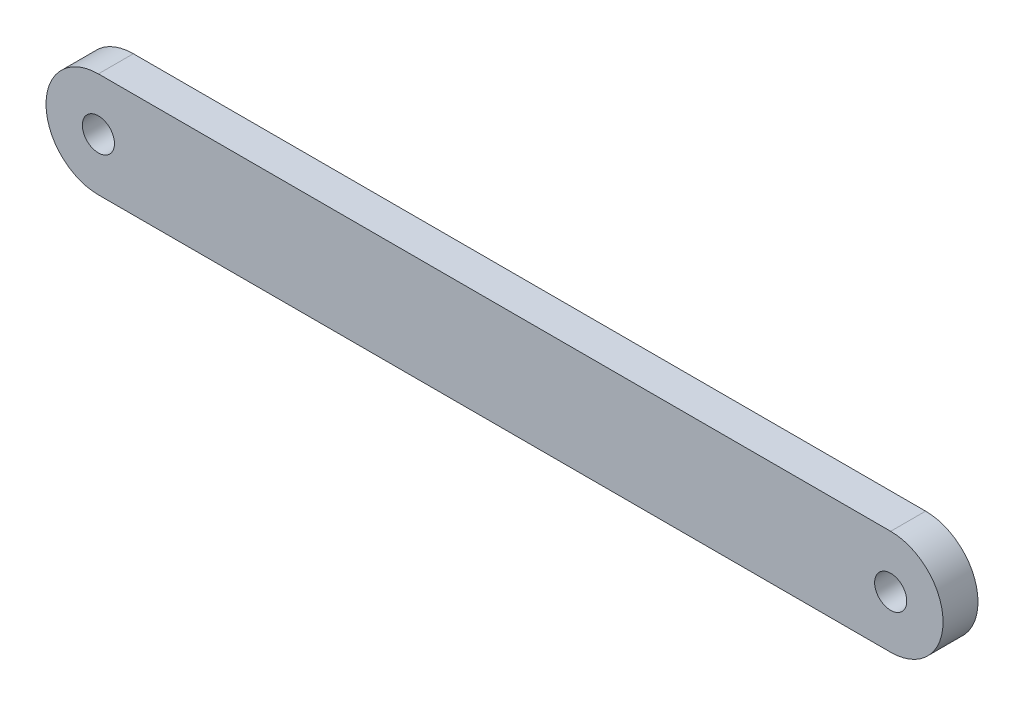
ISO-10303-21;
HEADER;
FILE_DESCRIPTION(('STEP AP214'),'2;1');
FILE_NAME('part.step','',(''),(''),'','','');
FILE_SCHEMA(('AUTOMOTIVE_DESIGN { 1 0 10303 214 1 1 1 1 }'));
ENDSEC;
DATA;
#1=APPLICATION_CONTEXT('core data for automotive mechanical design processes');
#2=APPLICATION_PROTOCOL_DEFINITION('international standard','automotive_design',2000,#1);
#3=PRODUCT_CONTEXT('',#1,'mechanical');
#4=PRODUCT('Part','Part','',(#3));
#5=PRODUCT_RELATED_PRODUCT_CATEGORY('part','',(#4));
#6=PRODUCT_DEFINITION_FORMATION('','',#4);
#7=PRODUCT_DEFINITION_CONTEXT('part definition',#1,'design');
#8=PRODUCT_DEFINITION('design','',#6,#7);
#9=PRODUCT_DEFINITION_SHAPE('','',#8);
#10=(LENGTH_UNIT() NAMED_UNIT(*) SI_UNIT(.MILLI.,.METRE.));
#11=(NAMED_UNIT(*) PLANE_ANGLE_UNIT() SI_UNIT($,.RADIAN.));
#12=(NAMED_UNIT(*) SI_UNIT($,.STERADIAN.) SOLID_ANGLE_UNIT());
#13=UNCERTAINTY_MEASURE_WITH_UNIT(LENGTH_MEASURE(1.E-05),#10,'distance_accuracy_value','');
#14=(GEOMETRIC_REPRESENTATION_CONTEXT(3) GLOBAL_UNCERTAINTY_ASSIGNED_CONTEXT((#13)) GLOBAL_UNIT_ASSIGNED_CONTEXT((#10,
#11,#12)) REPRESENTATION_CONTEXT('',''));
#15=CARTESIAN_POINT('',(0.,0.,0.));
#16=DIRECTION('',(0.,0.,1.));
#17=DIRECTION('',(1.,0.,0.));
#18=AXIS2_PLACEMENT_3D('',#15,#16,#17);
#19=CARTESIAN_POINT('',(56.7,0.,5.));
#20=DIRECTION('',(0.,0.,-1.));
#21=DIRECTION('',(-1.,0.,0.));
#22=AXIS2_PLACEMENT_3D('',#19,#20,#21);
#23=PLANE('',#22);
#24=CARTESIAN_POINT('',(56.7,0.,5.));
#25=DIRECTION('',(0.,0.,1.));
#26=DIRECTION('',(-1.,0.,0.));
#27=AXIS2_PLACEMENT_3D('',#24,#25,#26);
#28=CIRCLE('',#27,7.5);
#29=CARTESIAN_POINT('',(56.7,-7.5,5.));
#30=VERTEX_POINT('',#29);
#31=CARTESIAN_POINT('',(56.7,7.5,5.));
#32=VERTEX_POINT('',#31);
#33=EDGE_CURVE('E87',#30,#32,#28,.T.);
#34=ORIENTED_EDGE('',*,*,#33,.T.);
#35=DIRECTION('',(-1.,0.,0.));
#36=VECTOR('',#35,1.);
#37=CARTESIAN_POINT('',(-56.7,7.5,5.));
#38=LINE('',#37,#36);
#39=CARTESIAN_POINT('',(-56.7,7.5,5.));
#40=VERTEX_POINT('',#39);
#41=EDGE_CURVE('E82',#32,#40,#38,.T.);
#42=ORIENTED_EDGE('',*,*,#41,.T.);
#43=CARTESIAN_POINT('',(-56.7,0.,5.));
#44=DIRECTION('',(0.,0.,1.));
#45=DIRECTION('',(1.,0.,0.));
#46=AXIS2_PLACEMENT_3D('',#43,#44,#45);
#47=CIRCLE('',#46,7.5);
#48=CARTESIAN_POINT('',(-56.7,-7.5,5.));
#49=VERTEX_POINT('',#48);
#50=EDGE_CURVE('E85',#40,#49,#47,.T.);
#51=ORIENTED_EDGE('',*,*,#50,.T.);
#52=DIRECTION('',(1.,0.,0.));
#53=VECTOR('',#52,1.);
#54=CARTESIAN_POINT('',(-56.7,-7.5,5.));
#55=LINE('',#54,#53);
#56=EDGE_CURVE('E52',#49,#30,#55,.T.);
#57=ORIENTED_EDGE('',*,*,#56,.T.);
#58=EDGE_LOOP('',(#34,#42,#51,#57));
#59=FACE_BOUND('',#58,.T.);
#60=CARTESIAN_POINT('',(-56.7,0.,5.));
#61=DIRECTION('',(0.,0.,1.));
#62=DIRECTION('',(1.,0.,0.));
#63=AXIS2_PLACEMENT_3D('',#60,#61,#62);
#64=CIRCLE('',#63,2.3);
#65=CARTESIAN_POINT('',(-54.4,0.,5.));
#66=VERTEX_POINT('',#65);
#67=EDGE_CURVE('E102',#66,#66,#64,.T.);
#68=ORIENTED_EDGE('',*,*,#67,.F.);
#69=EDGE_LOOP('',(#68));
#70=FACE_BOUND('',#69,.T.);
#71=CARTESIAN_POINT('',(56.7,0.,5.));
#72=DIRECTION('',(0.,0.,1.));
#73=DIRECTION('',(1.,0.,0.));
#74=AXIS2_PLACEMENT_3D('',#71,#72,#73);
#75=CIRCLE('',#74,2.30000000000001);
#76=CARTESIAN_POINT('',(59.,0.,5.));
#77=VERTEX_POINT('',#76);
#78=EDGE_CURVE('E117',#77,#77,#75,.T.);
#79=ORIENTED_EDGE('',*,*,#78,.F.);
#80=EDGE_LOOP('',(#79));
#81=FACE_BOUND('',#80,.T.);
#82=ADVANCED_FACE('F35',(#59,#70,#81),#23,.F.);
#83=CARTESIAN_POINT('',(56.7,0.,0.));
#84=DIRECTION('',(0.,0.,-1.));
#85=DIRECTION('',(-1.,0.,0.));
#86=AXIS2_PLACEMENT_3D('',#83,#84,#85);
#87=PLANE('',#86);
#88=CARTESIAN_POINT('',(-56.7,0.,0.));
#89=DIRECTION('',(0.,0.,1.));
#90=DIRECTION('',(1.,0.,0.));
#91=AXIS2_PLACEMENT_3D('',#88,#89,#90);
#92=CIRCLE('',#91,2.3);
#93=CARTESIAN_POINT('',(-54.4,0.,0.));
#94=VERTEX_POINT('',#93);
#95=EDGE_CURVE('E114',#94,#94,#92,.T.);
#96=ORIENTED_EDGE('',*,*,#95,.T.);
#97=EDGE_LOOP('',(#96));
#98=FACE_BOUND('',#97,.T.);
#99=CARTESIAN_POINT('',(56.7,0.,0.));
#100=DIRECTION('',(0.,0.,1.));
#101=DIRECTION('',(-1.,0.,0.));
#102=AXIS2_PLACEMENT_3D('',#99,#100,#101);
#103=CIRCLE('',#102,7.5);
#104=CARTESIAN_POINT('',(56.7,-7.5,0.));
#105=VERTEX_POINT('',#104);
#106=CARTESIAN_POINT('',(56.7,7.5,0.));
#107=VERTEX_POINT('',#106);
#108=EDGE_CURVE('E99',#105,#107,#103,.T.);
#109=ORIENTED_EDGE('',*,*,#108,.F.);
#110=DIRECTION('',(1.,0.,0.));
#111=VECTOR('',#110,1.);
#112=CARTESIAN_POINT('',(-56.7,-7.5,0.));
#113=LINE('',#112,#111);
#114=CARTESIAN_POINT('',(-56.7,-7.5,0.));
#115=VERTEX_POINT('',#114);
#116=EDGE_CURVE('E75',#115,#105,#113,.T.);
#117=ORIENTED_EDGE('',*,*,#116,.F.);
#118=CARTESIAN_POINT('',(-56.7,0.,0.));
#119=DIRECTION('',(0.,0.,1.));
#120=DIRECTION('',(1.,0.,0.));
#121=AXIS2_PLACEMENT_3D('',#118,#119,#120);
#122=CIRCLE('',#121,7.5);
#123=CARTESIAN_POINT('',(-56.7,7.5,0.));
#124=VERTEX_POINT('',#123);
#125=EDGE_CURVE('E69',#124,#115,#122,.T.);
#126=ORIENTED_EDGE('',*,*,#125,.F.);
#127=DIRECTION('',(-1.,0.,0.));
#128=VECTOR('',#127,1.);
#129=CARTESIAN_POINT('',(-56.7,7.5,0.));
#130=LINE('',#129,#128);
#131=EDGE_CURVE('E91',#107,#124,#130,.T.);
#132=ORIENTED_EDGE('',*,*,#131,.F.);
#133=EDGE_LOOP('',(#109,#117,#126,#132));
#134=FACE_BOUND('',#133,.T.);
#135=CARTESIAN_POINT('',(56.7,0.,0.));
#136=DIRECTION('',(0.,0.,1.));
#137=DIRECTION('',(1.,0.,0.));
#138=AXIS2_PLACEMENT_3D('',#135,#136,#137);
#139=CIRCLE('',#138,2.30000000000001);
#140=CARTESIAN_POINT('',(59.,0.,0.));
#141=VERTEX_POINT('',#140);
#142=EDGE_CURVE('E120',#141,#141,#139,.T.);
#143=ORIENTED_EDGE('',*,*,#142,.T.);
#144=EDGE_LOOP('',(#143));
#145=FACE_BOUND('',#144,.T.);
#146=ADVANCED_FACE('F110',(#98,#134,#145),#87,.T.);
#147=CARTESIAN_POINT('',(56.7,0.,5.));
#148=DIRECTION('',(0.,0.,-1.));
#149=DIRECTION('',(-1.,0.,0.));
#150=AXIS2_PLACEMENT_3D('',#147,#148,#149);
#151=CYLINDRICAL_SURFACE('',#150,7.5);
#152=ORIENTED_EDGE('',*,*,#108,.T.);
#153=DIRECTION('',(0.,0.,-1.));
#154=VECTOR('',#153,1.);
#155=CARTESIAN_POINT('',(56.7,7.5,5.));
#156=LINE('',#155,#154);
#157=EDGE_CURVE('E11',#32,#107,#156,.T.);
#158=ORIENTED_EDGE('',*,*,#157,.F.);
#159=ORIENTED_EDGE('',*,*,#33,.F.);
#160=DIRECTION('',(0.,0.,-1.));
#161=VECTOR('',#160,1.);
#162=CARTESIAN_POINT('',(56.7,-7.5,5.));
#163=LINE('',#162,#161);
#164=EDGE_CURVE('E95',#30,#105,#163,.T.);
#165=ORIENTED_EDGE('',*,*,#164,.T.);
#166=EDGE_LOOP('',(#152,#158,#159,#165));
#167=FACE_BOUND('',#166,.T.);
#168=ADVANCED_FACE('F37',(#167),#151,.T.);
#169=CARTESIAN_POINT('',(-56.7,7.5,5.));
#170=DIRECTION('',(0.,-1.,0.));
#171=DIRECTION('',(0.,0.,-1.));
#172=AXIS2_PLACEMENT_3D('',#169,#170,#171);
#173=PLANE('',#172);
#174=ORIENTED_EDGE('',*,*,#131,.T.);
#175=DIRECTION('',(0.,0.,-1.));
#176=VECTOR('',#175,1.);
#177=CARTESIAN_POINT('',(-56.7,7.5,5.));
#178=LINE('',#177,#176);
#179=EDGE_CURVE('E44',#40,#124,#178,.T.);
#180=ORIENTED_EDGE('',*,*,#179,.F.);
#181=ORIENTED_EDGE('',*,*,#41,.F.);
#182=ORIENTED_EDGE('',*,*,#157,.T.);
#183=EDGE_LOOP('',(#174,#180,#181,#182));
#184=FACE_BOUND('',#183,.T.);
#185=ADVANCED_FACE('F90',(#184),#173,.F.);
#186=CARTESIAN_POINT('',(-56.7,0.,5.));
#187=DIRECTION('',(0.,0.,-1.));
#188=DIRECTION('',(-1.,0.,0.));
#189=AXIS2_PLACEMENT_3D('',#186,#187,#188);
#190=CYLINDRICAL_SURFACE('',#189,7.5);
#191=ORIENTED_EDGE('',*,*,#125,.T.);
#192=DIRECTION('',(0.,0.,-1.));
#193=VECTOR('',#192,1.);
#194=CARTESIAN_POINT('',(-56.7,-7.5,5.));
#195=LINE('',#194,#193);
#196=EDGE_CURVE('E92',#49,#115,#195,.T.);
#197=ORIENTED_EDGE('',*,*,#196,.F.);
#198=ORIENTED_EDGE('',*,*,#50,.F.);
#199=ORIENTED_EDGE('',*,*,#179,.T.);
#200=EDGE_LOOP('',(#191,#197,#198,#199));
#201=FACE_BOUND('',#200,.T.);
#202=ADVANCED_FACE('F93',(#201),#190,.T.);
#203=CARTESIAN_POINT('',(-56.7,-7.5,5.));
#204=DIRECTION('',(0.,1.,0.));
#205=DIRECTION('',(0.,0.,1.));
#206=AXIS2_PLACEMENT_3D('',#203,#204,#205);
#207=PLANE('',#206);
#208=ORIENTED_EDGE('',*,*,#116,.T.);
#209=ORIENTED_EDGE('',*,*,#164,.F.);
#210=ORIENTED_EDGE('',*,*,#56,.F.);
#211=ORIENTED_EDGE('',*,*,#196,.T.);
#212=EDGE_LOOP('',(#208,#209,#210,#211));
#213=FACE_BOUND('',#212,.T.);
#214=ADVANCED_FACE('F107',(#213),#207,.F.);
#215=CARTESIAN_POINT('',(-56.7,0.,5.));
#216=DIRECTION('',(0.,0.,-1.));
#217=DIRECTION('',(-1.,0.,0.));
#218=AXIS2_PLACEMENT_3D('',#215,#216,#217);
#219=CYLINDRICAL_SURFACE('',#218,2.3);
#220=ORIENTED_EDGE('',*,*,#67,.T.);
#221=EDGE_LOOP('',(#220));
#222=FACE_BOUND('',#221,.T.);
#223=ORIENTED_EDGE('',*,*,#95,.F.);
#224=EDGE_LOOP('',(#223));
#225=FACE_BOUND('',#224,.T.);
#226=ADVANCED_FACE('F137',(#222,#225),#219,.F.);
#227=CARTESIAN_POINT('',(56.7,0.,5.));
#228=DIRECTION('',(0.,0.,-1.));
#229=DIRECTION('',(-1.,0.,0.));
#230=AXIS2_PLACEMENT_3D('',#227,#228,#229);
#231=CYLINDRICAL_SURFACE('',#230,2.30000000000001);
#232=ORIENTED_EDGE('',*,*,#78,.T.);
#233=EDGE_LOOP('',(#232));
#234=FACE_BOUND('',#233,.T.);
#235=ORIENTED_EDGE('',*,*,#142,.F.);
#236=EDGE_LOOP('',(#235));
#237=FACE_BOUND('',#236,.T.);
#238=ADVANCED_FACE('F126',(#234,#237),#231,.F.);
#239=CLOSED_SHELL('',(#82,#146,#168,#185,#202,#214,#226,#238));
#240=MANIFOLD_SOLID_BREP('B2',#239);
#241=ADVANCED_BREP_SHAPE_REPRESENTATION('',(#18,#240),#14);
#242=SHAPE_DEFINITION_REPRESENTATION(#9,#241);
ENDSEC;
END-ISO-10303-21;
